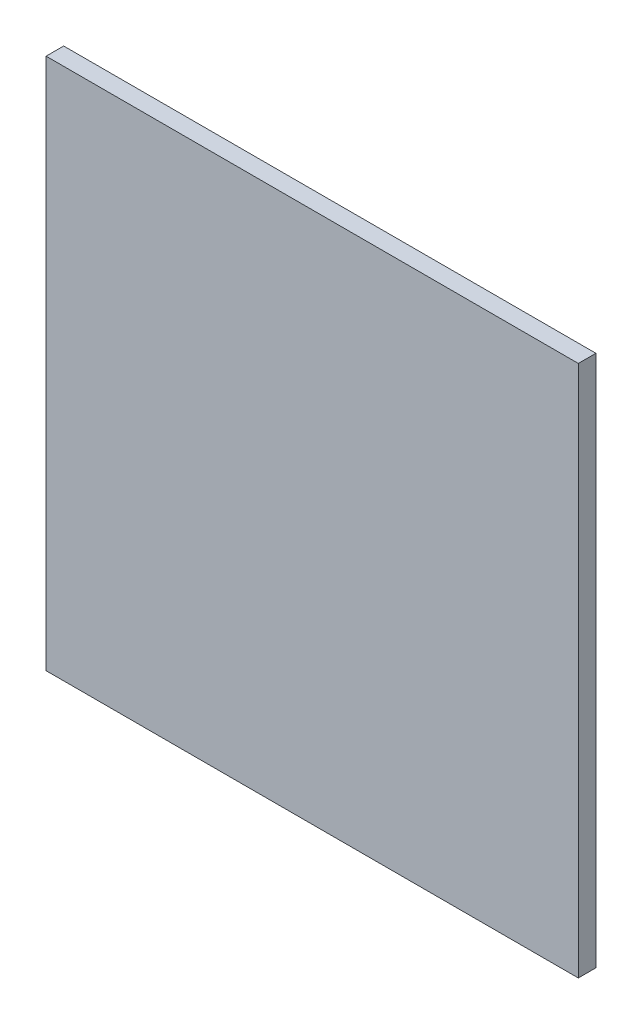
ISO-10303-21;
HEADER;
FILE_DESCRIPTION(('STEP AP214'),'2;1');
FILE_NAME('part.step','',(''),(''),'','','');
FILE_SCHEMA(('AUTOMOTIVE_DESIGN { 1 0 10303 214 1 1 1 1 }'));
ENDSEC;
DATA;
#1=APPLICATION_CONTEXT('core data for automotive mechanical design processes');
#2=APPLICATION_PROTOCOL_DEFINITION('international standard','automotive_design',2000,#1);
#3=PRODUCT_CONTEXT('',#1,'mechanical');
#4=PRODUCT('Part','Part','',(#3));
#5=PRODUCT_RELATED_PRODUCT_CATEGORY('part','',(#4));
#6=PRODUCT_DEFINITION_FORMATION('','',#4);
#7=PRODUCT_DEFINITION_CONTEXT('part definition',#1,'design');
#8=PRODUCT_DEFINITION('design','',#6,#7);
#9=PRODUCT_DEFINITION_SHAPE('','',#8);
#10=(LENGTH_UNIT() NAMED_UNIT(*) SI_UNIT(.MILLI.,.METRE.));
#11=(NAMED_UNIT(*) PLANE_ANGLE_UNIT() SI_UNIT($,.RADIAN.));
#12=(NAMED_UNIT(*) SI_UNIT($,.STERADIAN.) SOLID_ANGLE_UNIT());
#13=UNCERTAINTY_MEASURE_WITH_UNIT(LENGTH_MEASURE(1.E-05),#10,'distance_accuracy_value','');
#14=(GEOMETRIC_REPRESENTATION_CONTEXT(3) GLOBAL_UNCERTAINTY_ASSIGNED_CONTEXT((#13)) GLOBAL_UNIT_ASSIGNED_CONTEXT((#10,
#11,#12)) REPRESENTATION_CONTEXT('',''));
#15=CARTESIAN_POINT('',(0.,0.,0.));
#16=DIRECTION('',(0.,0.,1.));
#17=DIRECTION('',(1.,0.,0.));
#18=AXIS2_PLACEMENT_3D('',#15,#16,#17);
#19=CARTESIAN_POINT('',(-397.7,452.299999999999,1.5));
#20=DIRECTION('',(-1.,0.,0.));
#21=DIRECTION('',(0.,0.,1.));
#22=AXIS2_PLACEMENT_3D('',#19,#20,#21);
#23=PLANE('',#22);
#24=DIRECTION('',(0.,1.,0.));
#25=VECTOR('',#24,1.);
#26=CARTESIAN_POINT('',(-397.7,452.299999999999,0.));
#27=LINE('',#26,#25);
#28=CARTESIAN_POINT('',(-397.7,452.299999999999,0.));
#29=VERTEX_POINT('',#28);
#30=CARTESIAN_POINT('',(-397.699999999999,497.699999999999,0.));
#31=VERTEX_POINT('',#30);
#32=EDGE_CURVE('E88',#29,#31,#27,.T.);
#33=ORIENTED_EDGE('',*,*,#32,.F.);
#34=DIRECTION('',(0.,0.,-1.));
#35=VECTOR('',#34,1.);
#36=CARTESIAN_POINT('',(-397.7,452.299999999999,1.5));
#37=LINE('',#36,#35);
#38=CARTESIAN_POINT('',(-397.7,452.299999999999,1.5));
#39=VERTEX_POINT('',#38);
#40=EDGE_CURVE('E11',#39,#29,#37,.T.);
#41=ORIENTED_EDGE('',*,*,#40,.F.);
#42=DIRECTION('',(0.,1.,0.));
#43=VECTOR('',#42,1.);
#44=CARTESIAN_POINT('',(-397.7,452.299999999999,1.5));
#45=LINE('',#44,#43);
#46=CARTESIAN_POINT('',(-397.699999999999,497.699999999999,1.5));
#47=VERTEX_POINT('',#46);
#48=EDGE_CURVE('E78',#39,#47,#45,.T.);
#49=ORIENTED_EDGE('',*,*,#48,.T.);
#50=DIRECTION('',(0.,0.,-1.));
#51=VECTOR('',#50,1.);
#52=CARTESIAN_POINT('',(-397.699999999999,497.699999999999,1.5));
#53=LINE('',#52,#51);
#54=EDGE_CURVE('E19',#47,#31,#53,.T.);
#55=ORIENTED_EDGE('',*,*,#54,.T.);
#56=EDGE_LOOP('',(#33,#41,#49,#55));
#57=FACE_BOUND('',#56,.T.);
#58=ADVANCED_FACE('F16',(#57),#23,.T.);
#59=CARTESIAN_POINT('',(-352.3,452.3,1.5));
#60=DIRECTION('',(0.,-1.,0.));
#61=DIRECTION('',(1.,0.,0.));
#62=AXIS2_PLACEMENT_3D('',#59,#60,#61);
#63=PLANE('',#62);
#64=DIRECTION('',(-1.,0.,0.));
#65=VECTOR('',#64,1.);
#66=CARTESIAN_POINT('',(-352.3,452.3,0.));
#67=LINE('',#66,#65);
#68=CARTESIAN_POINT('',(-352.3,452.3,0.));
#69=VERTEX_POINT('',#68);
#70=EDGE_CURVE('E83',#69,#29,#67,.T.);
#71=ORIENTED_EDGE('',*,*,#70,.F.);
#72=DIRECTION('',(0.,0.,-1.));
#73=VECTOR('',#72,1.);
#74=CARTESIAN_POINT('',(-352.3,452.3,1.5));
#75=LINE('',#74,#73);
#76=CARTESIAN_POINT('',(-352.3,452.3,1.5));
#77=VERTEX_POINT('',#76);
#78=EDGE_CURVE('E26',#77,#69,#75,.T.);
#79=ORIENTED_EDGE('',*,*,#78,.F.);
#80=DIRECTION('',(-1.,0.,0.));
#81=VECTOR('',#80,1.);
#82=CARTESIAN_POINT('',(-352.3,452.3,1.5));
#83=LINE('',#82,#81);
#84=EDGE_CURVE('E73',#77,#39,#83,.T.);
#85=ORIENTED_EDGE('',*,*,#84,.T.);
#86=ORIENTED_EDGE('',*,*,#40,.T.);
#87=EDGE_LOOP('',(#71,#79,#85,#86));
#88=FACE_BOUND('',#87,.T.);
#89=ADVANCED_FACE('F104',(#88),#63,.T.);
#90=CARTESIAN_POINT('',(-352.299999999999,497.7,1.5));
#91=DIRECTION('',(1.,0.,0.));
#92=DIRECTION('',(0.,0.,-1.));
#93=AXIS2_PLACEMENT_3D('',#90,#91,#92);
#94=PLANE('',#93);
#95=DIRECTION('',(0.,-1.,0.));
#96=VECTOR('',#95,1.);
#97=CARTESIAN_POINT('',(-352.299999999999,497.7,0.));
#98=LINE('',#97,#96);
#99=CARTESIAN_POINT('',(-352.299999999999,497.7,0.));
#100=VERTEX_POINT('',#99);
#101=EDGE_CURVE('E67',#100,#69,#98,.T.);
#102=ORIENTED_EDGE('',*,*,#101,.F.);
#103=DIRECTION('',(0.,0.,-1.));
#104=VECTOR('',#103,1.);
#105=CARTESIAN_POINT('',(-352.299999999999,497.7,1.5));
#106=LINE('',#105,#104);
#107=CARTESIAN_POINT('',(-352.299999999999,497.7,1.5));
#108=VERTEX_POINT('',#107);
#109=EDGE_CURVE('E62',#108,#100,#106,.T.);
#110=ORIENTED_EDGE('',*,*,#109,.F.);
#111=DIRECTION('',(0.,-1.,0.));
#112=VECTOR('',#111,1.);
#113=CARTESIAN_POINT('',(-352.299999999999,497.7,1.5));
#114=LINE('',#113,#112);
#115=EDGE_CURVE('E65',#108,#77,#114,.T.);
#116=ORIENTED_EDGE('',*,*,#115,.T.);
#117=ORIENTED_EDGE('',*,*,#78,.T.);
#118=EDGE_LOOP('',(#102,#110,#116,#117));
#119=FACE_BOUND('',#118,.T.);
#120=ADVANCED_FACE('F64',(#119),#94,.T.);
#121=CARTESIAN_POINT('',(-397.699999999999,497.699999999999,1.5));
#122=DIRECTION('',(0.,1.,0.));
#123=DIRECTION('',(0.,0.,1.));
#124=AXIS2_PLACEMENT_3D('',#121,#122,#123);
#125=PLANE('',#124);
#126=DIRECTION('',(1.,0.,0.));
#127=VECTOR('',#126,1.);
#128=CARTESIAN_POINT('',(-397.699999999999,497.699999999999,0.));
#129=LINE('',#128,#127);
#130=EDGE_CURVE('E91',#31,#100,#129,.T.);
#131=ORIENTED_EDGE('',*,*,#130,.F.);
#132=ORIENTED_EDGE('',*,*,#54,.F.);
#133=DIRECTION('',(1.,0.,0.));
#134=VECTOR('',#133,1.);
#135=CARTESIAN_POINT('',(-397.699999999999,497.699999999999,1.5));
#136=LINE('',#135,#134);
#137=EDGE_CURVE('E72',#47,#108,#136,.T.);
#138=ORIENTED_EDGE('',*,*,#137,.T.);
#139=ORIENTED_EDGE('',*,*,#109,.T.);
#140=EDGE_LOOP('',(#131,#132,#138,#139));
#141=FACE_BOUND('',#140,.T.);
#142=ADVANCED_FACE('F76',(#141),#125,.T.);
#143=CARTESIAN_POINT('',(0.,0.,1.5));
#144=DIRECTION('',(0.,0.,-1.));
#145=DIRECTION('',(-1.,0.,0.));
#146=AXIS2_PLACEMENT_3D('',#143,#144,#145);
#147=PLANE('',#146);
#148=ORIENTED_EDGE('',*,*,#48,.F.);
#149=ORIENTED_EDGE('',*,*,#84,.F.);
#150=ORIENTED_EDGE('',*,*,#115,.F.);
#151=ORIENTED_EDGE('',*,*,#137,.F.);
#152=EDGE_LOOP('',(#148,#149,#150,#151));
#153=FACE_BOUND('',#152,.T.);
#154=ADVANCED_FACE('F71',(#153),#147,.F.);
#155=CARTESIAN_POINT('',(0.,0.,0.));
#156=DIRECTION('',(0.,0.,-1.));
#157=DIRECTION('',(-1.,0.,0.));
#158=AXIS2_PLACEMENT_3D('',#155,#156,#157);
#159=PLANE('',#158);
#160=ORIENTED_EDGE('',*,*,#32,.T.);
#161=ORIENTED_EDGE('',*,*,#130,.T.);
#162=ORIENTED_EDGE('',*,*,#101,.T.);
#163=ORIENTED_EDGE('',*,*,#70,.T.);
#164=EDGE_LOOP('',(#160,#161,#162,#163));
#165=FACE_BOUND('',#164,.T.);
#166=ADVANCED_FACE('F103',(#165),#159,.T.);
#167=CLOSED_SHELL('',(#58,#89,#120,#142,#154,#166));
#168=MANIFOLD_SOLID_BREP('B1',#167);
#169=ADVANCED_BREP_SHAPE_REPRESENTATION('',(#18,#168),#14);
#170=SHAPE_DEFINITION_REPRESENTATION(#9,#169);
ENDSEC;
END-ISO-10303-21;
